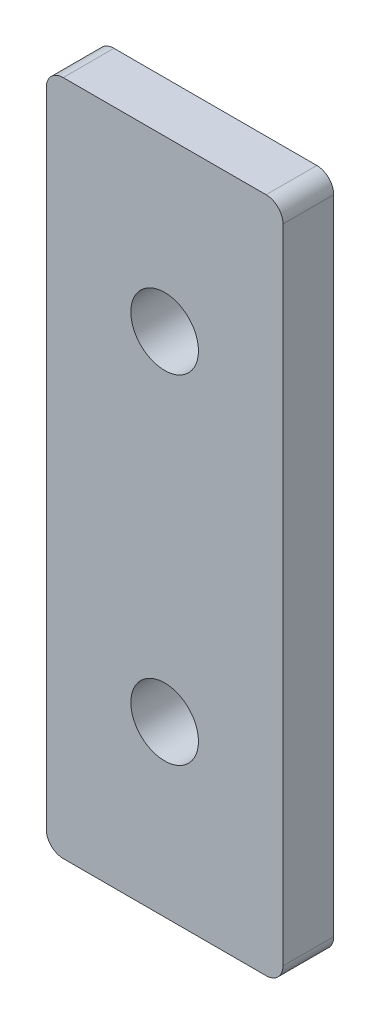
ISO-10303-21;
HEADER;
FILE_DESCRIPTION(('STEP AP214'),'2;1');
FILE_NAME('part.step','',(''),(''),'','','');
FILE_SCHEMA(('AUTOMOTIVE_DESIGN { 1 0 10303 214 1 1 1 1 }'));
ENDSEC;
DATA;
#1=APPLICATION_CONTEXT('core data for automotive mechanical design processes');
#2=APPLICATION_PROTOCOL_DEFINITION('international standard','automotive_design',2000,#1);
#3=PRODUCT_CONTEXT('',#1,'mechanical');
#4=PRODUCT('Part','Part','',(#3));
#5=PRODUCT_RELATED_PRODUCT_CATEGORY('part','',(#4));
#6=PRODUCT_DEFINITION_FORMATION('','',#4);
#7=PRODUCT_DEFINITION_CONTEXT('part definition',#1,'design');
#8=PRODUCT_DEFINITION('design','',#6,#7);
#9=PRODUCT_DEFINITION_SHAPE('','',#8);
#10=(LENGTH_UNIT() NAMED_UNIT(*) SI_UNIT(.MILLI.,.METRE.));
#11=(NAMED_UNIT(*) PLANE_ANGLE_UNIT() SI_UNIT($,.RADIAN.));
#12=(NAMED_UNIT(*) SI_UNIT($,.STERADIAN.) SOLID_ANGLE_UNIT());
#13=UNCERTAINTY_MEASURE_WITH_UNIT(LENGTH_MEASURE(1.E-05),#10,'distance_accuracy_value','');
#14=(GEOMETRIC_REPRESENTATION_CONTEXT(3) GLOBAL_UNCERTAINTY_ASSIGNED_CONTEXT((#13)) GLOBAL_UNIT_ASSIGNED_CONTEXT((#10,
#11,#12)) REPRESENTATION_CONTEXT('',''));
#15=CARTESIAN_POINT('',(0.,0.,0.));
#16=DIRECTION('',(0.,0.,1.));
#17=DIRECTION('',(1.,0.,0.));
#18=AXIS2_PLACEMENT_3D('',#15,#16,#17);
#19=CARTESIAN_POINT('',(0.,0.,3.));
#20=DIRECTION('',(0.,0.,-1.));
#21=DIRECTION('',(-1.,0.,0.));
#22=AXIS2_PLACEMENT_3D('',#19,#20,#21);
#23=PLANE('',#22);
#24=DIRECTION('',(1.,0.,0.));
#25=VECTOR('',#24,1.);
#26=CARTESIAN_POINT('',(0.,0.,3.));
#27=LINE('',#26,#25);
#28=CARTESIAN_POINT('',(1.,0.,3.));
#29=VERTEX_POINT('',#28);
#30=CARTESIAN_POINT('',(13.,0.,3.));
#31=VERTEX_POINT('',#30);
#32=EDGE_CURVE('E168',#29,#31,#27,.T.);
#33=ORIENTED_EDGE('',*,*,#32,.T.);
#34=CARTESIAN_POINT('',(13.,1.,3.));
#35=DIRECTION('',(0.,0.,-1.));
#36=DIRECTION('',(-1.,0.,0.));
#37=AXIS2_PLACEMENT_3D('',#34,#35,#36);
#38=CIRCLE('',#37,1.);
#39=CARTESIAN_POINT('',(14.,1.,3.));
#40=VERTEX_POINT('',#39);
#41=EDGE_CURVE('E146',#31,#40,#38,.F.);
#42=ORIENTED_EDGE('',*,*,#41,.T.);
#43=DIRECTION('',(0.,1.,0.));
#44=VECTOR('',#43,1.);
#45=CARTESIAN_POINT('',(14.,0.,3.));
#46=LINE('',#45,#44);
#47=CARTESIAN_POINT('',(14.,39.,3.));
#48=VERTEX_POINT('',#47);
#49=EDGE_CURVE('E116',#40,#48,#46,.T.);
#50=ORIENTED_EDGE('',*,*,#49,.T.);
#51=CARTESIAN_POINT('',(13.,39.,3.));
#52=DIRECTION('',(0.,0.,-1.));
#53=DIRECTION('',(-1.,0.,0.));
#54=AXIS2_PLACEMENT_3D('',#51,#52,#53);
#55=CIRCLE('',#54,1.);
#56=CARTESIAN_POINT('',(13.,40.,3.));
#57=VERTEX_POINT('',#56);
#58=EDGE_CURVE('E52',#48,#57,#55,.F.);
#59=ORIENTED_EDGE('',*,*,#58,.T.);
#60=DIRECTION('',(-1.,0.,0.));
#61=VECTOR('',#60,1.);
#62=CARTESIAN_POINT('',(0.,40.,3.));
#63=LINE('',#62,#61);
#64=CARTESIAN_POINT('',(1.,40.,3.));
#65=VERTEX_POINT('',#64);
#66=EDGE_CURVE('E132',#57,#65,#63,.T.);
#67=ORIENTED_EDGE('',*,*,#66,.T.);
#68=CARTESIAN_POINT('',(1.,39.,3.));
#69=DIRECTION('',(0.,0.,-1.));
#70=DIRECTION('',(-1.,0.,0.));
#71=AXIS2_PLACEMENT_3D('',#68,#69,#70);
#72=CIRCLE('',#71,1.);
#73=CARTESIAN_POINT('',(0.,39.,3.));
#74=VERTEX_POINT('',#73);
#75=EDGE_CURVE('E142',#65,#74,#72,.F.);
#76=ORIENTED_EDGE('',*,*,#75,.T.);
#77=DIRECTION('',(0.,-1.,0.));
#78=VECTOR('',#77,1.);
#79=CARTESIAN_POINT('',(0.,0.,3.));
#80=LINE('',#79,#78);
#81=CARTESIAN_POINT('',(0.,1.,3.));
#82=VERTEX_POINT('',#81);
#83=EDGE_CURVE('E126',#74,#82,#80,.T.);
#84=ORIENTED_EDGE('',*,*,#83,.T.);
#85=CARTESIAN_POINT('',(1.,1.,3.));
#86=DIRECTION('',(0.,0.,-1.));
#87=DIRECTION('',(-1.,0.,0.));
#88=AXIS2_PLACEMENT_3D('',#85,#86,#87);
#89=CIRCLE('',#88,1.);
#90=EDGE_CURVE('E144',#82,#29,#89,.F.);
#91=ORIENTED_EDGE('',*,*,#90,.T.);
#92=EDGE_LOOP('',(#33,#42,#50,#59,#67,#76,#84,#91));
#93=FACE_BOUND('',#92,.T.);
#94=CARTESIAN_POINT('',(7.,10.,3.));
#95=DIRECTION('',(0.,0.,1.));
#96=DIRECTION('',(1.,0.,0.));
#97=AXIS2_PLACEMENT_3D('',#94,#95,#96);
#98=CIRCLE('',#97,2.);
#99=CARTESIAN_POINT('',(9.,10.,3.));
#100=VERTEX_POINT('',#99);
#101=EDGE_CURVE('E177',#100,#100,#98,.T.);
#102=ORIENTED_EDGE('',*,*,#101,.F.);
#103=EDGE_LOOP('',(#102));
#104=FACE_BOUND('',#103,.T.);
#105=CARTESIAN_POINT('',(7.,30.,3.));
#106=DIRECTION('',(0.,0.,1.));
#107=DIRECTION('',(1.,0.,0.));
#108=AXIS2_PLACEMENT_3D('',#105,#106,#107);
#109=CIRCLE('',#108,2.);
#110=CARTESIAN_POINT('',(9.,30.,3.));
#111=VERTEX_POINT('',#110);
#112=EDGE_CURVE('E182',#111,#111,#109,.T.);
#113=ORIENTED_EDGE('',*,*,#112,.F.);
#114=EDGE_LOOP('',(#113));
#115=FACE_BOUND('',#114,.T.);
#116=ADVANCED_FACE('F32',(#93,#104,#115),#23,.F.);
#117=CARTESIAN_POINT('',(0.,0.,0.));
#118=DIRECTION('',(0.,0.,-1.));
#119=DIRECTION('',(-1.,0.,0.));
#120=AXIS2_PLACEMENT_3D('',#117,#118,#119);
#121=PLANE('',#120);
#122=CARTESIAN_POINT('',(7.,10.,0.));
#123=DIRECTION('',(0.,0.,1.));
#124=DIRECTION('',(1.,0.,0.));
#125=AXIS2_PLACEMENT_3D('',#122,#123,#124);
#126=CIRCLE('',#125,2.);
#127=CARTESIAN_POINT('',(9.,10.,0.));
#128=VERTEX_POINT('',#127);
#129=EDGE_CURVE('E173',#128,#128,#126,.T.);
#130=ORIENTED_EDGE('',*,*,#129,.T.);
#131=EDGE_LOOP('',(#130));
#132=FACE_BOUND('',#131,.T.);
#133=DIRECTION('',(0.,1.,0.));
#134=VECTOR('',#133,1.);
#135=CARTESIAN_POINT('',(14.,0.,0.));
#136=LINE('',#135,#134);
#137=CARTESIAN_POINT('',(14.,1.,0.));
#138=VERTEX_POINT('',#137);
#139=CARTESIAN_POINT('',(14.,39.,0.));
#140=VERTEX_POINT('',#139);
#141=EDGE_CURVE('E114',#138,#140,#136,.T.);
#142=ORIENTED_EDGE('',*,*,#141,.F.);
#143=CARTESIAN_POINT('',(13.,1.,0.));
#144=DIRECTION('',(0.,0.,-1.));
#145=DIRECTION('',(-1.,0.,0.));
#146=AXIS2_PLACEMENT_3D('',#143,#144,#145);
#147=CIRCLE('',#146,1.);
#148=CARTESIAN_POINT('',(13.,0.,0.));
#149=VERTEX_POINT('',#148);
#150=EDGE_CURVE('E97',#138,#149,#147,.T.);
#151=ORIENTED_EDGE('',*,*,#150,.T.);
#152=DIRECTION('',(1.,0.,0.));
#153=VECTOR('',#152,1.);
#154=CARTESIAN_POINT('',(0.,0.,0.));
#155=LINE('',#154,#153);
#156=CARTESIAN_POINT('',(1.,0.,0.));
#157=VERTEX_POINT('',#156);
#158=EDGE_CURVE('E124',#157,#149,#155,.T.);
#159=ORIENTED_EDGE('',*,*,#158,.F.);
#160=CARTESIAN_POINT('',(1.,1.,0.));
#161=DIRECTION('',(0.,0.,-1.));
#162=DIRECTION('',(-1.,0.,0.));
#163=AXIS2_PLACEMENT_3D('',#160,#161,#162);
#164=CIRCLE('',#163,1.);
#165=CARTESIAN_POINT('',(0.,1.,0.));
#166=VERTEX_POINT('',#165);
#167=EDGE_CURVE('E108',#157,#166,#164,.T.);
#168=ORIENTED_EDGE('',*,*,#167,.T.);
#169=DIRECTION('',(0.,-1.,0.));
#170=VECTOR('',#169,1.);
#171=CARTESIAN_POINT('',(0.,0.,0.));
#172=LINE('',#171,#170);
#173=CARTESIAN_POINT('',(0.,39.,0.));
#174=VERTEX_POINT('',#173);
#175=EDGE_CURVE('E128',#174,#166,#172,.T.);
#176=ORIENTED_EDGE('',*,*,#175,.F.);
#177=CARTESIAN_POINT('',(1.,39.,0.));
#178=DIRECTION('',(0.,0.,-1.));
#179=DIRECTION('',(-1.,0.,0.));
#180=AXIS2_PLACEMENT_3D('',#177,#178,#179);
#181=CIRCLE('',#180,1.);
#182=CARTESIAN_POINT('',(1.,40.,0.));
#183=VERTEX_POINT('',#182);
#184=EDGE_CURVE('E135',#174,#183,#181,.T.);
#185=ORIENTED_EDGE('',*,*,#184,.T.);
#186=DIRECTION('',(-1.,0.,0.));
#187=VECTOR('',#186,1.);
#188=CARTESIAN_POINT('',(0.,40.,0.));
#189=LINE('',#188,#187);
#190=CARTESIAN_POINT('',(13.,40.,0.));
#191=VERTEX_POINT('',#190);
#192=EDGE_CURVE('E123',#191,#183,#189,.T.);
#193=ORIENTED_EDGE('',*,*,#192,.F.);
#194=CARTESIAN_POINT('',(13.,39.,0.));
#195=DIRECTION('',(0.,0.,-1.));
#196=DIRECTION('',(-1.,0.,0.));
#197=AXIS2_PLACEMENT_3D('',#194,#195,#196);
#198=CIRCLE('',#197,1.);
#199=EDGE_CURVE('E117',#191,#140,#198,.T.);
#200=ORIENTED_EDGE('',*,*,#199,.T.);
#201=EDGE_LOOP('',(#142,#151,#159,#168,#176,#185,#193,#200));
#202=FACE_BOUND('',#201,.T.);
#203=CARTESIAN_POINT('',(7.,30.,0.));
#204=DIRECTION('',(0.,0.,1.));
#205=DIRECTION('',(1.,0.,0.));
#206=AXIS2_PLACEMENT_3D('',#203,#204,#205);
#207=CIRCLE('',#206,2.);
#208=CARTESIAN_POINT('',(9.,30.,0.));
#209=VERTEX_POINT('',#208);
#210=EDGE_CURVE('E184',#209,#209,#207,.T.);
#211=ORIENTED_EDGE('',*,*,#210,.T.);
#212=EDGE_LOOP('',(#211));
#213=FACE_BOUND('',#212,.T.);
#214=ADVANCED_FACE('F120',(#132,#202,#213),#121,.T.);
#215=CARTESIAN_POINT('',(0.,0.,3.));
#216=DIRECTION('',(1.,0.,0.));
#217=DIRECTION('',(0.,0.,-1.));
#218=AXIS2_PLACEMENT_3D('',#215,#216,#217);
#219=PLANE('',#218);
#220=ORIENTED_EDGE('',*,*,#175,.T.);
#221=DIRECTION('',(0.,0.,-1.));
#222=VECTOR('',#221,1.);
#223=CARTESIAN_POINT('',(0.,1.,3.));
#224=LINE('',#223,#222);
#225=EDGE_CURVE('E151',#166,#82,#224,.F.);
#226=ORIENTED_EDGE('',*,*,#225,.T.);
#227=ORIENTED_EDGE('',*,*,#83,.F.);
#228=DIRECTION('',(0.,0.,-1.));
#229=VECTOR('',#228,1.);
#230=CARTESIAN_POINT('',(0.,39.,3.));
#231=LINE('',#230,#229);
#232=EDGE_CURVE('E148',#74,#174,#231,.T.);
#233=ORIENTED_EDGE('',*,*,#232,.T.);
#234=EDGE_LOOP('',(#220,#226,#227,#233));
#235=FACE_BOUND('',#234,.T.);
#236=ADVANCED_FACE('F164',(#235),#219,.F.);
#237=CARTESIAN_POINT('',(0.,0.,3.));
#238=DIRECTION('',(0.,1.,0.));
#239=DIRECTION('',(0.,0.,1.));
#240=AXIS2_PLACEMENT_3D('',#237,#238,#239);
#241=PLANE('',#240);
#242=ORIENTED_EDGE('',*,*,#158,.T.);
#243=DIRECTION('',(0.,0.,-1.));
#244=VECTOR('',#243,1.);
#245=CARTESIAN_POINT('',(13.,0.,3.));
#246=LINE('',#245,#244);
#247=EDGE_CURVE('E102',#149,#31,#246,.F.);
#248=ORIENTED_EDGE('',*,*,#247,.T.);
#249=ORIENTED_EDGE('',*,*,#32,.F.);
#250=DIRECTION('',(0.,0.,-1.));
#251=VECTOR('',#250,1.);
#252=CARTESIAN_POINT('',(1.,0.,3.));
#253=LINE('',#252,#251);
#254=EDGE_CURVE('E107',#29,#157,#253,.T.);
#255=ORIENTED_EDGE('',*,*,#254,.T.);
#256=EDGE_LOOP('',(#242,#248,#249,#255));
#257=FACE_BOUND('',#256,.T.);
#258=ADVANCED_FACE('F209',(#257),#241,.F.);
#259=CARTESIAN_POINT('',(14.,0.,3.));
#260=DIRECTION('',(-1.,0.,0.));
#261=DIRECTION('',(0.,0.,1.));
#262=AXIS2_PLACEMENT_3D('',#259,#260,#261);
#263=PLANE('',#262);
#264=ORIENTED_EDGE('',*,*,#49,.F.);
#265=DIRECTION('',(0.,0.,-1.));
#266=VECTOR('',#265,1.);
#267=CARTESIAN_POINT('',(14.,1.,3.));
#268=LINE('',#267,#266);
#269=EDGE_CURVE('E101',#40,#138,#268,.T.);
#270=ORIENTED_EDGE('',*,*,#269,.T.);
#271=ORIENTED_EDGE('',*,*,#141,.T.);
#272=DIRECTION('',(0.,0.,-1.));
#273=VECTOR('',#272,1.);
#274=CARTESIAN_POINT('',(14.,39.,3.));
#275=LINE('',#274,#273);
#276=EDGE_CURVE('E118',#140,#48,#275,.F.);
#277=ORIENTED_EDGE('',*,*,#276,.T.);
#278=EDGE_LOOP('',(#264,#270,#271,#277));
#279=FACE_BOUND('',#278,.T.);
#280=ADVANCED_FACE('F113',(#279),#263,.F.);
#281=CARTESIAN_POINT('',(0.,40.,3.));
#282=DIRECTION('',(0.,-1.,0.));
#283=DIRECTION('',(0.,0.,-1.));
#284=AXIS2_PLACEMENT_3D('',#281,#282,#283);
#285=PLANE('',#284);
#286=ORIENTED_EDGE('',*,*,#192,.T.);
#287=DIRECTION('',(0.,0.,-1.));
#288=VECTOR('',#287,1.);
#289=CARTESIAN_POINT('',(1.,40.,3.));
#290=LINE('',#289,#288);
#291=EDGE_CURVE('E11',#183,#65,#290,.F.);
#292=ORIENTED_EDGE('',*,*,#291,.T.);
#293=ORIENTED_EDGE('',*,*,#66,.F.);
#294=DIRECTION('',(0.,0.,-1.));
#295=VECTOR('',#294,1.);
#296=CARTESIAN_POINT('',(13.,40.,3.));
#297=LINE('',#296,#295);
#298=EDGE_CURVE('E40',#57,#191,#297,.T.);
#299=ORIENTED_EDGE('',*,*,#298,.T.);
#300=EDGE_LOOP('',(#286,#292,#293,#299));
#301=FACE_BOUND('',#300,.T.);
#302=ADVANCED_FACE('F154',(#301),#285,.F.);
#303=CARTESIAN_POINT('',(7.,10.,3.));
#304=DIRECTION('',(0.,0.,-1.));
#305=DIRECTION('',(-1.,0.,0.));
#306=AXIS2_PLACEMENT_3D('',#303,#304,#305);
#307=CYLINDRICAL_SURFACE('',#306,2.);
#308=ORIENTED_EDGE('',*,*,#101,.T.);
#309=EDGE_LOOP('',(#308));
#310=FACE_BOUND('',#309,.T.);
#311=ORIENTED_EDGE('',*,*,#129,.F.);
#312=EDGE_LOOP('',(#311));
#313=FACE_BOUND('',#312,.T.);
#314=ADVANCED_FACE('F202',(#310,#313),#307,.F.);
#315=CARTESIAN_POINT('',(7.,30.,3.));
#316=DIRECTION('',(0.,0.,-1.));
#317=DIRECTION('',(-1.,0.,0.));
#318=AXIS2_PLACEMENT_3D('',#315,#316,#317);
#319=CYLINDRICAL_SURFACE('',#318,2.);
#320=ORIENTED_EDGE('',*,*,#112,.T.);
#321=EDGE_LOOP('',(#320));
#322=FACE_BOUND('',#321,.T.);
#323=ORIENTED_EDGE('',*,*,#210,.F.);
#324=EDGE_LOOP('',(#323));
#325=FACE_BOUND('',#324,.T.);
#326=ADVANCED_FACE('F190',(#322,#325),#319,.F.);
#327=CARTESIAN_POINT('',(13.,1.,3.));
#328=DIRECTION('',(0.,0.,-1.));
#329=DIRECTION('',(-1.,0.,0.));
#330=AXIS2_PLACEMENT_3D('',#327,#328,#329);
#331=CYLINDRICAL_SURFACE('',#330,1.);
#332=ORIENTED_EDGE('',*,*,#41,.F.);
#333=ORIENTED_EDGE('',*,*,#247,.F.);
#334=ORIENTED_EDGE('',*,*,#150,.F.);
#335=ORIENTED_EDGE('',*,*,#269,.F.);
#336=EDGE_LOOP('',(#332,#333,#334,#335));
#337=FACE_BOUND('',#336,.T.);
#338=ADVANCED_FACE('F100',(#337),#331,.T.);
#339=CARTESIAN_POINT('',(1.,1.,3.));
#340=DIRECTION('',(0.,0.,-1.));
#341=DIRECTION('',(-1.,0.,0.));
#342=AXIS2_PLACEMENT_3D('',#339,#340,#341);
#343=CYLINDRICAL_SURFACE('',#342,1.);
#344=ORIENTED_EDGE('',*,*,#90,.F.);
#345=ORIENTED_EDGE('',*,*,#225,.F.);
#346=ORIENTED_EDGE('',*,*,#167,.F.);
#347=ORIENTED_EDGE('',*,*,#254,.F.);
#348=EDGE_LOOP('',(#344,#345,#346,#347));
#349=FACE_BOUND('',#348,.T.);
#350=ADVANCED_FACE('F217',(#349),#343,.T.);
#351=CARTESIAN_POINT('',(1.,39.,3.));
#352=DIRECTION('',(0.,0.,-1.));
#353=DIRECTION('',(-1.,0.,0.));
#354=AXIS2_PLACEMENT_3D('',#351,#352,#353);
#355=CYLINDRICAL_SURFACE('',#354,1.);
#356=ORIENTED_EDGE('',*,*,#75,.F.);
#357=ORIENTED_EDGE('',*,*,#291,.F.);
#358=ORIENTED_EDGE('',*,*,#184,.F.);
#359=ORIENTED_EDGE('',*,*,#232,.F.);
#360=EDGE_LOOP('',(#356,#357,#358,#359));
#361=FACE_BOUND('',#360,.T.);
#362=ADVANCED_FACE('F161',(#361),#355,.T.);
#363=CARTESIAN_POINT('',(13.,39.,3.));
#364=DIRECTION('',(0.,0.,-1.));
#365=DIRECTION('',(-1.,0.,0.));
#366=AXIS2_PLACEMENT_3D('',#363,#364,#365);
#367=CYLINDRICAL_SURFACE('',#366,1.);
#368=ORIENTED_EDGE('',*,*,#58,.F.);
#369=ORIENTED_EDGE('',*,*,#276,.F.);
#370=ORIENTED_EDGE('',*,*,#199,.F.);
#371=ORIENTED_EDGE('',*,*,#298,.F.);
#372=EDGE_LOOP('',(#368,#369,#370,#371));
#373=FACE_BOUND('',#372,.T.);
#374=ADVANCED_FACE('F34',(#373),#367,.T.);
#375=CLOSED_SHELL('',(#116,#214,#236,#258,#280,#302,#314,#326,#338,#350,#362,#374));
#376=MANIFOLD_SOLID_BREP('B2',#375);
#377=ADVANCED_BREP_SHAPE_REPRESENTATION('',(#18,#376),#14);
#378=SHAPE_DEFINITION_REPRESENTATION(#9,#377);
ENDSEC;
END-ISO-10303-21;
